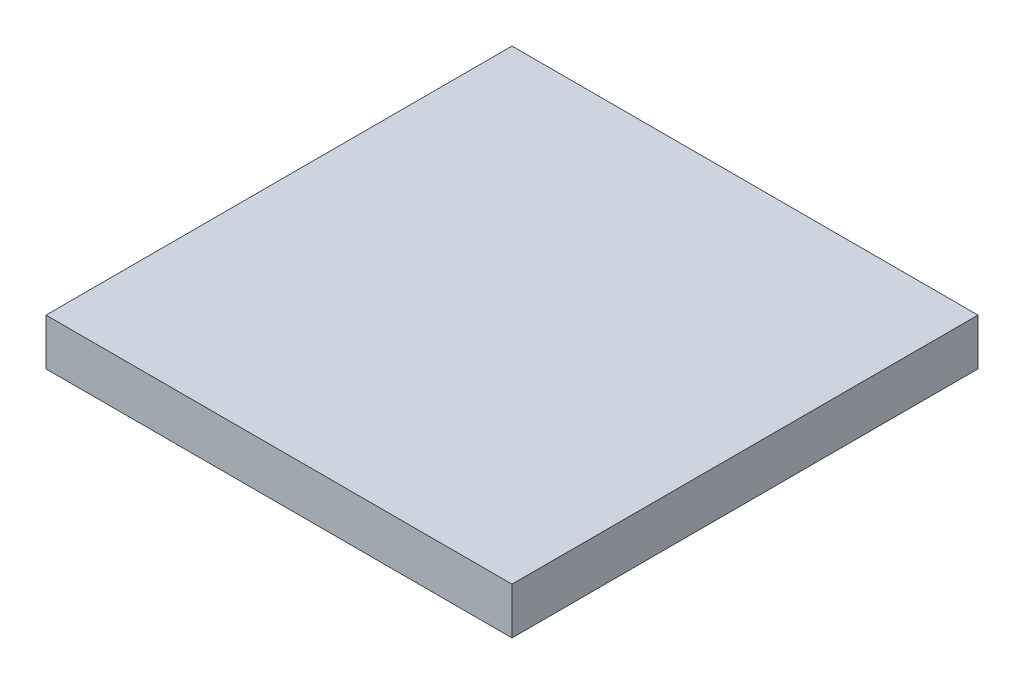
ISO-10303-21;
HEADER;
FILE_DESCRIPTION(('STEP AP214'),'2;1');
FILE_NAME('part.step','',(''),(''),'','','');
FILE_SCHEMA(('AUTOMOTIVE_DESIGN { 1 0 10303 214 1 1 1 1 }'));
ENDSEC;
DATA;
#1=APPLICATION_CONTEXT('core data for automotive mechanical design processes');
#2=APPLICATION_PROTOCOL_DEFINITION('international standard','automotive_design',2000,#1);
#3=PRODUCT_CONTEXT('',#1,'mechanical');
#4=PRODUCT('Part','Part','',(#3));
#5=PRODUCT_RELATED_PRODUCT_CATEGORY('part','',(#4));
#6=PRODUCT_DEFINITION_FORMATION('','',#4);
#7=PRODUCT_DEFINITION_CONTEXT('part definition',#1,'design');
#8=PRODUCT_DEFINITION('design','',#6,#7);
#9=PRODUCT_DEFINITION_SHAPE('','',#8);
#10=(LENGTH_UNIT() NAMED_UNIT(*) SI_UNIT(.MILLI.,.METRE.));
#11=(NAMED_UNIT(*) PLANE_ANGLE_UNIT() SI_UNIT($,.RADIAN.));
#12=(NAMED_UNIT(*) SI_UNIT($,.STERADIAN.) SOLID_ANGLE_UNIT());
#13=UNCERTAINTY_MEASURE_WITH_UNIT(LENGTH_MEASURE(1.E-05),#10,'distance_accuracy_value','');
#14=(GEOMETRIC_REPRESENTATION_CONTEXT(3) GLOBAL_UNCERTAINTY_ASSIGNED_CONTEXT((#13)) GLOBAL_UNIT_ASSIGNED_CONTEXT((#10,
#11,#12)) REPRESENTATION_CONTEXT('',''));
#15=CARTESIAN_POINT('',(0.,0.,0.));
#16=DIRECTION('',(0.,0.,1.));
#17=DIRECTION('',(1.,0.,0.));
#18=AXIS2_PLACEMENT_3D('',#15,#16,#17);
#19=CARTESIAN_POINT('',(15.,3.,-15.));
#20=DIRECTION('',(-1.,0.,0.));
#21=DIRECTION('',(0.,0.,1.));
#22=AXIS2_PLACEMENT_3D('',#19,#20,#21);
#23=PLANE('',#22);
#24=DIRECTION('',(0.,0.,-1.));
#25=VECTOR('',#24,1.);
#26=CARTESIAN_POINT('',(15.,0.,-15.));
#27=LINE('',#26,#25);
#28=CARTESIAN_POINT('',(15.,0.,15.));
#29=VERTEX_POINT('',#28);
#30=CARTESIAN_POINT('',(15.,0.,-15.));
#31=VERTEX_POINT('',#30);
#32=EDGE_CURVE('E109',#29,#31,#27,.T.);
#33=ORIENTED_EDGE('',*,*,#32,.T.);
#34=DIRECTION('',(0.,-1.,0.));
#35=VECTOR('',#34,1.);
#36=CARTESIAN_POINT('',(15.,3.,-15.));
#37=LINE('',#36,#35);
#38=CARTESIAN_POINT('',(15.,3.,-15.));
#39=VERTEX_POINT('',#38);
#40=EDGE_CURVE('E11',#39,#31,#37,.T.);
#41=ORIENTED_EDGE('',*,*,#40,.F.);
#42=DIRECTION('',(0.,0.,-1.));
#43=VECTOR('',#42,1.);
#44=CARTESIAN_POINT('',(15.,3.,-15.));
#45=LINE('',#44,#43);
#46=CARTESIAN_POINT('',(15.,3.,15.));
#47=VERTEX_POINT('',#46);
#48=EDGE_CURVE('E93',#47,#39,#45,.T.);
#49=ORIENTED_EDGE('',*,*,#48,.F.);
#50=DIRECTION('',(0.,-1.,0.));
#51=VECTOR('',#50,1.);
#52=CARTESIAN_POINT('',(15.,3.,15.));
#53=LINE('',#52,#51);
#54=EDGE_CURVE('E105',#47,#29,#53,.T.);
#55=ORIENTED_EDGE('',*,*,#54,.T.);
#56=EDGE_LOOP('',(#33,#41,#49,#55));
#57=FACE_BOUND('',#56,.T.);
#58=ADVANCED_FACE('F41',(#57),#23,.F.);
#59=CARTESIAN_POINT('',(-15.,3.,-15.));
#60=DIRECTION('',(0.,0.,1.));
#61=DIRECTION('',(1.,0.,0.));
#62=AXIS2_PLACEMENT_3D('',#59,#60,#61);
#63=PLANE('',#62);
#64=DIRECTION('',(-1.,0.,0.));
#65=VECTOR('',#64,1.);
#66=CARTESIAN_POINT('',(-15.,0.,-15.));
#67=LINE('',#66,#65);
#68=CARTESIAN_POINT('',(-15.,0.,-15.));
#69=VERTEX_POINT('',#68);
#70=EDGE_CURVE('E98',#31,#69,#67,.T.);
#71=ORIENTED_EDGE('',*,*,#70,.T.);
#72=DIRECTION('',(0.,-1.,0.));
#73=VECTOR('',#72,1.);
#74=CARTESIAN_POINT('',(-15.,3.,-15.));
#75=LINE('',#74,#73);
#76=CARTESIAN_POINT('',(-15.,3.,-15.));
#77=VERTEX_POINT('',#76);
#78=EDGE_CURVE('E50',#77,#69,#75,.T.);
#79=ORIENTED_EDGE('',*,*,#78,.F.);
#80=DIRECTION('',(-1.,0.,0.));
#81=VECTOR('',#80,1.);
#82=CARTESIAN_POINT('',(-15.,3.,-15.));
#83=LINE('',#82,#81);
#84=EDGE_CURVE('E88',#39,#77,#83,.T.);
#85=ORIENTED_EDGE('',*,*,#84,.F.);
#86=ORIENTED_EDGE('',*,*,#40,.T.);
#87=EDGE_LOOP('',(#71,#79,#85,#86));
#88=FACE_BOUND('',#87,.T.);
#89=ADVANCED_FACE('F97',(#88),#63,.F.);
#90=CARTESIAN_POINT('',(-15.,3.,-15.));
#91=DIRECTION('',(1.,0.,0.));
#92=DIRECTION('',(0.,0.,-1.));
#93=AXIS2_PLACEMENT_3D('',#90,#91,#92);
#94=PLANE('',#93);
#95=DIRECTION('',(0.,0.,1.));
#96=VECTOR('',#95,1.);
#97=CARTESIAN_POINT('',(-15.,0.,-15.));
#98=LINE('',#97,#96);
#99=CARTESIAN_POINT('',(-15.,0.,15.));
#100=VERTEX_POINT('',#99);
#101=EDGE_CURVE('E75',#69,#100,#98,.T.);
#102=ORIENTED_EDGE('',*,*,#101,.T.);
#103=DIRECTION('',(0.,-1.,0.));
#104=VECTOR('',#103,1.);
#105=CARTESIAN_POINT('',(-15.,3.,15.));
#106=LINE('',#105,#104);
#107=CARTESIAN_POINT('',(-15.,3.,15.));
#108=VERTEX_POINT('',#107);
#109=EDGE_CURVE('E100',#108,#100,#106,.T.);
#110=ORIENTED_EDGE('',*,*,#109,.F.);
#111=DIRECTION('',(0.,0.,1.));
#112=VECTOR('',#111,1.);
#113=CARTESIAN_POINT('',(-15.,3.,-15.));
#114=LINE('',#113,#112);
#115=EDGE_CURVE('E91',#77,#108,#114,.T.);
#116=ORIENTED_EDGE('',*,*,#115,.F.);
#117=ORIENTED_EDGE('',*,*,#78,.T.);
#118=EDGE_LOOP('',(#102,#110,#116,#117));
#119=FACE_BOUND('',#118,.T.);
#120=ADVANCED_FACE('F101',(#119),#94,.F.);
#121=CARTESIAN_POINT('',(-15.,3.,15.));
#122=DIRECTION('',(0.,0.,-1.));
#123=DIRECTION('',(-1.,0.,0.));
#124=AXIS2_PLACEMENT_3D('',#121,#122,#123);
#125=PLANE('',#124);
#126=DIRECTION('',(1.,0.,0.));
#127=VECTOR('',#126,1.);
#128=CARTESIAN_POINT('',(-15.,0.,15.));
#129=LINE('',#128,#127);
#130=EDGE_CURVE('E81',#100,#29,#129,.T.);
#131=ORIENTED_EDGE('',*,*,#130,.T.);
#132=ORIENTED_EDGE('',*,*,#54,.F.);
#133=DIRECTION('',(1.,0.,0.));
#134=VECTOR('',#133,1.);
#135=CARTESIAN_POINT('',(-15.,3.,15.));
#136=LINE('',#135,#134);
#137=EDGE_CURVE('E58',#108,#47,#136,.T.);
#138=ORIENTED_EDGE('',*,*,#137,.F.);
#139=ORIENTED_EDGE('',*,*,#109,.T.);
#140=EDGE_LOOP('',(#131,#132,#138,#139));
#141=FACE_BOUND('',#140,.T.);
#142=ADVANCED_FACE('F122',(#141),#125,.F.);
#143=CARTESIAN_POINT('',(0.,3.,0.));
#144=DIRECTION('',(0.,1.,0.));
#145=DIRECTION('',(0.,0.,1.));
#146=AXIS2_PLACEMENT_3D('',#143,#144,#145);
#147=PLANE('',#146);
#148=ORIENTED_EDGE('',*,*,#48,.T.);
#149=ORIENTED_EDGE('',*,*,#84,.T.);
#150=ORIENTED_EDGE('',*,*,#115,.T.);
#151=ORIENTED_EDGE('',*,*,#137,.T.);
#152=EDGE_LOOP('',(#148,#149,#150,#151));
#153=FACE_BOUND('',#152,.T.);
#154=ADVANCED_FACE('F89',(#153),#147,.T.);
#155=CARTESIAN_POINT('',(0.,0.,0.));
#156=DIRECTION('',(0.,1.,0.));
#157=DIRECTION('',(0.,0.,1.));
#158=AXIS2_PLACEMENT_3D('',#155,#156,#157);
#159=PLANE('',#158);
#160=ORIENTED_EDGE('',*,*,#32,.F.);
#161=ORIENTED_EDGE('',*,*,#130,.F.);
#162=ORIENTED_EDGE('',*,*,#101,.F.);
#163=ORIENTED_EDGE('',*,*,#70,.F.);
#164=EDGE_LOOP('',(#160,#161,#162,#163));
#165=FACE_BOUND('',#164,.T.);
#166=ADVANCED_FACE('F125',(#165),#159,.F.);
#167=CLOSED_SHELL('',(#58,#89,#120,#142,#154,#166));
#168=MANIFOLD_SOLID_BREP('B2',#167);
#169=ADVANCED_BREP_SHAPE_REPRESENTATION('',(#18,#168),#14);
#170=SHAPE_DEFINITION_REPRESENTATION(#9,#169);
ENDSEC;
END-ISO-10303-21;
